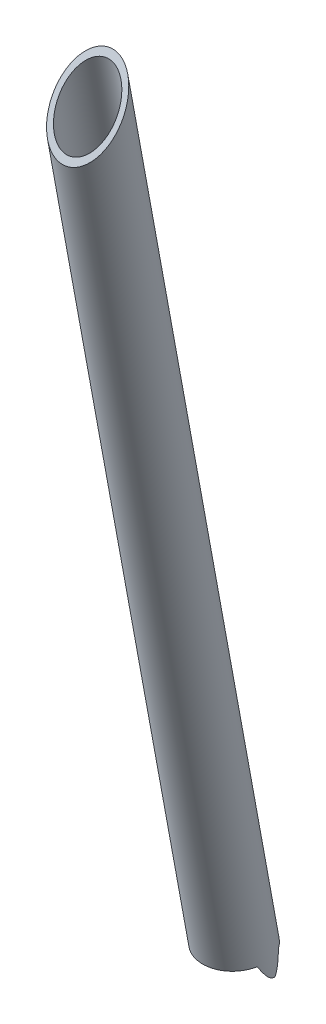
ISO-10303-21;
HEADER;
FILE_DESCRIPTION(('STEP AP214'),'2;1');
FILE_NAME('part.step','',(''),(''),'','','');
FILE_SCHEMA(('AUTOMOTIVE_DESIGN { 1 0 10303 214 1 1 1 1 }'));
ENDSEC;
DATA;
#1=APPLICATION_CONTEXT('core data for automotive mechanical design processes');
#2=APPLICATION_PROTOCOL_DEFINITION('international standard','automotive_design',2000,#1);
#3=PRODUCT_CONTEXT('',#1,'mechanical');
#4=PRODUCT('Part','Part','',(#3));
#5=PRODUCT_RELATED_PRODUCT_CATEGORY('part','',(#4));
#6=PRODUCT_DEFINITION_FORMATION('','',#4);
#7=PRODUCT_DEFINITION_CONTEXT('part definition',#1,'design');
#8=PRODUCT_DEFINITION('design','',#6,#7);
#9=PRODUCT_DEFINITION_SHAPE('','',#8);
#10=(LENGTH_UNIT() NAMED_UNIT(*) SI_UNIT(.MILLI.,.METRE.));
#11=(NAMED_UNIT(*) PLANE_ANGLE_UNIT() SI_UNIT($,.RADIAN.));
#12=(NAMED_UNIT(*) SI_UNIT($,.STERADIAN.) SOLID_ANGLE_UNIT());
#13=UNCERTAINTY_MEASURE_WITH_UNIT(LENGTH_MEASURE(1.E-05),#10,'distance_accuracy_value','');
#14=(GEOMETRIC_REPRESENTATION_CONTEXT(3) GLOBAL_UNCERTAINTY_ASSIGNED_CONTEXT((#13)) GLOBAL_UNIT_ASSIGNED_CONTEXT((#10,
#11,#12)) REPRESENTATION_CONTEXT('',''));
#15=CARTESIAN_POINT('',(0.,0.,0.));
#16=DIRECTION('',(0.,0.,1.));
#17=DIRECTION('',(1.,0.,0.));
#18=AXIS2_PLACEMENT_3D('',#15,#16,#17);
#19=CARTESIAN_POINT('',(325.,320.,-1580.));
#20=DIRECTION('',(-0.214351342090107,-0.914565726251124,-0.342962147344171));
#21=DIRECTION('',(0.,0.351123441588391,-0.936329177569045));
#22=AXIS2_PLACEMENT_3D('',#19,#20,#21);
#23=CYLINDRICAL_SURFACE('',#22,7.90000000000002);
#24=CARTESIAN_POINT('',(252.34375,10.,-1696.25));
#25=DIRECTION('',(0.,-1.,0.));
#26=DIRECTION('',(-0.52999894000318,0.,-0.847998304005088));
#27=AXIS2_PLACEMENT_3D('',#24,#25,#26);
#28=ELLIPSE('',#27,8.63797950572971,7.90000000000002);
#29=CARTESIAN_POINT('',(247.765630018194,10.,-1703.57499197089));
#30=VERTEX_POINT('',#29);
#31=EDGE_CURVE('E86',#30,#30,#28,.T.);
#32=ORIENTED_EDGE('',*,*,#31,.T.);
#33=EDGE_LOOP('',(#32));
#34=FACE_BOUND('',#33,.T.);
#35=CARTESIAN_POINT('',(325.,320.,-1580.));
#36=DIRECTION('',(-0.0100583123703583,0.349879267870479,0.936740801004567));
#37=DIRECTION('',(-0.287052887423583,-0.898369431045867,0.332465043552115));
#38=AXIS2_PLACEMENT_3D('',#35,#36,#37);
#39=ELLIPSE('',#38,12.3611674531331,7.90000000000002);
#40=CARTESIAN_POINT('',(321.451691190652,308.895105028066,-1575.89034392434));
#41=VERTEX_POINT('',#40);
#42=EDGE_CURVE('E45',#41,#41,#39,.T.);
#43=ORIENTED_EDGE('',*,*,#42,.T.);
#44=EDGE_LOOP('',(#43));
#45=FACE_BOUND('',#44,.T.);
#46=ADVANCED_FACE('F41',(#34,#45),#23,.F.);
#47=CARTESIAN_POINT('',(325.,320.,-1580.));
#48=DIRECTION('',(-0.214351342090107,-0.914565726251124,-0.342962147344171));
#49=DIRECTION('',(0.,0.351123441588391,-0.936329177569045));
#50=AXIS2_PLACEMENT_3D('',#47,#48,#49);
#51=CYLINDRICAL_SURFACE('',#50,9.49999999999999);
#52=CARTESIAN_POINT('',(258.509137658845,36.3056540110711,-1686.38537974585));
#53=DIRECTION('',(-0.993532672656404,0.,-0.113546591160732));
#54=DIRECTION('',(0.03712393124551,-0.945042024116468,-0.324834398398211));
#55=AXIS2_PLACEMENT_3D('',#52,#53,#54);
#56=ELLIPSE('',#55,37.712293737374,9.49999999999999);
#57=CARTESIAN_POINT('',(260.240282329124,10.,-1701.53289561079));
#58=VERTEX_POINT('',#57);
#59=CARTESIAN_POINT('',(260.141225962762,3.01994811422281,-1700.66615240513));
#60=VERTEX_POINT('',#59);
#61=EDGE_CURVE('E80',#58,#60,#56,.T.);
#62=ORIENTED_EDGE('',*,*,#61,.F.);
#63=CARTESIAN_POINT('',(252.34375,10.,-1696.25));
#64=DIRECTION('',(0.,-1.,0.));
#65=DIRECTION('',(-0.52999894000318,0.,-0.847998304005088));
#66=AXIS2_PLACEMENT_3D('',#63,#64,#65);
#67=ELLIPSE('',#66,10.3874437094218,9.49999999999999);
#68=CARTESIAN_POINT('',(261.924194176926,10.,-1693.53427954847));
#69=VERTEX_POINT('',#68);
#70=EDGE_CURVE('E70',#69,#58,#67,.T.);
#71=ORIENTED_EDGE('',*,*,#70,.F.);
#72=CARTESIAN_POINT('',(267.179606773407,73.2996555665376,-1672.51262916255));
#73=DIRECTION('',(-0.970142500145332,0.,0.242535625036333));
#74=DIRECTION('',(-0.0940407512885348,-0.921768805422756,-0.376163005154139));
#75=AXIS2_PLACEMENT_3D('',#72,#73,#74);
#76=ELLIPSE('',#75,76.1396046117398,9.49999999999999);
#77=EDGE_CURVE('E50',#60,#69,#76,.T.);
#78=ORIENTED_EDGE('',*,*,#77,.F.);
#79=EDGE_LOOP('',(#62,#71,#78));
#80=FACE_BOUND('',#79,.T.);
#81=CARTESIAN_POINT('',(325.,320.,-1580.));
#82=DIRECTION('',(-0.0100583123703583,0.349879267870479,0.936740801004567));
#83=DIRECTION('',(-0.287052887423583,-0.898369431045867,0.332465043552115));
#84=AXIS2_PLACEMENT_3D('',#81,#82,#83);
#85=ELLIPSE('',#84,14.8646950385778,9.49999999999999);
#86=CARTESIAN_POINT('',(320.733046368505,306.646012375523,-1575.05800851661));
#87=VERTEX_POINT('',#86);
#88=EDGE_CURVE('E11',#87,#87,#85,.T.);
#89=ORIENTED_EDGE('',*,*,#88,.F.);
#90=EDGE_LOOP('',(#89));
#91=FACE_BOUND('',#90,.T.);
#92=ADVANCED_FACE('F82',(#80,#91),#51,.T.);
#93=CARTESIAN_POINT('',(259.935326726564,10.,-1698.86453408839));
#94=DIRECTION('',(-0.993532672656404,0.,-0.113546591160732));
#95=DIRECTION('',(-0.113546591160732,0.,0.993532672656404));
#96=AXIS2_PLACEMENT_3D('',#93,#94,#95);
#97=PLANE('',#96);
#98=ORIENTED_EDGE('',*,*,#61,.T.);
#99=DIRECTION('',(0.,1.,0.));
#100=VECTOR('',#99,1.);
#101=CARTESIAN_POINT('',(260.141225962762,10.,-1700.66615240513));
#102=LINE('',#101,#100);
#103=CARTESIAN_POINT('',(260.141225962762,10.,-1700.66615240513));
#104=VERTEX_POINT('',#103);
#105=EDGE_CURVE('E58',#60,#104,#102,.T.);
#106=ORIENTED_EDGE('',*,*,#105,.T.);
#107=DIRECTION('',(-0.113546591160732,0.,0.993532672656404));
#108=VECTOR('',#107,1.);
#109=CARTESIAN_POINT('',(259.935326726564,10.,-1698.86453408839));
#110=LINE('',#109,#108);
#111=EDGE_CURVE('E73',#58,#104,#110,.T.);
#112=ORIENTED_EDGE('',*,*,#111,.F.);
#113=EDGE_LOOP('',(#98,#106,#112));
#114=FACE_BOUND('',#113,.T.);
#115=ADVANCED_FACE('F79',(#114),#97,.T.);
#116=CARTESIAN_POINT('',(259.935326726564,10.,-1698.86453408839));
#117=DIRECTION('',(0.,-1.,0.));
#118=DIRECTION('',(0.,0.,-1.));
#119=AXIS2_PLACEMENT_3D('',#116,#117,#118);
#120=PLANE('',#119);
#121=ORIENTED_EDGE('',*,*,#31,.F.);
#122=EDGE_LOOP('',(#121));
#123=FACE_BOUND('',#122,.T.);
#124=ORIENTED_EDGE('',*,*,#70,.T.);
#125=ORIENTED_EDGE('',*,*,#111,.T.);
#126=DIRECTION('',(0.242535625036333,0.,0.970142500145332));
#127=VECTOR('',#126,1.);
#128=CARTESIAN_POINT('',(184.701425001453,10.,-2002.42535625036));
#129=LINE('',#128,#127);
#130=EDGE_CURVE('E74',#104,#69,#129,.T.);
#131=ORIENTED_EDGE('',*,*,#130,.T.);
#132=EDGE_LOOP('',(#124,#125,#131));
#133=FACE_BOUND('',#132,.T.);
#134=ADVANCED_FACE('F72',(#123,#133),#120,.T.);
#135=CARTESIAN_POINT('',(184.701425001453,10.,-2002.42535625036));
#136=DIRECTION('',(-0.970142500145332,0.,0.242535625036333));
#137=DIRECTION('',(0.242535625036333,0.,0.970142500145332));
#138=AXIS2_PLACEMENT_3D('',#135,#136,#137);
#139=PLANE('',#138);
#140=ORIENTED_EDGE('',*,*,#77,.T.);
#141=ORIENTED_EDGE('',*,*,#130,.F.);
#142=ORIENTED_EDGE('',*,*,#105,.F.);
#143=EDGE_LOOP('',(#140,#141,#142));
#144=FACE_BOUND('',#143,.T.);
#145=ADVANCED_FACE('F96',(#144),#139,.T.);
#146=CARTESIAN_POINT('',(325.,320.,-1580.));
#147=DIRECTION('',(-0.0100583123703583,0.349879267870479,0.936740801004567));
#148=DIRECTION('',(0.,-0.936788189468734,0.349896967794652));
#149=AXIS2_PLACEMENT_3D('',#146,#147,#148);
#150=PLANE('',#149);
#151=ORIENTED_EDGE('',*,*,#42,.F.);
#152=EDGE_LOOP('',(#151));
#153=FACE_BOUND('',#152,.T.);
#154=ORIENTED_EDGE('',*,*,#88,.T.);
#155=EDGE_LOOP('',(#154));
#156=FACE_BOUND('',#155,.T.);
#157=ADVANCED_FACE('F43',(#153,#156),#150,.T.);
#158=CLOSED_SHELL('',(#46,#92,#115,#134,#145,#157));
#159=MANIFOLD_SOLID_BREP('B2',#158);
#160=ADVANCED_BREP_SHAPE_REPRESENTATION('',(#18,#159),#14);
#161=SHAPE_DEFINITION_REPRESENTATION(#9,#160);
ENDSEC;
END-ISO-10303-21;
